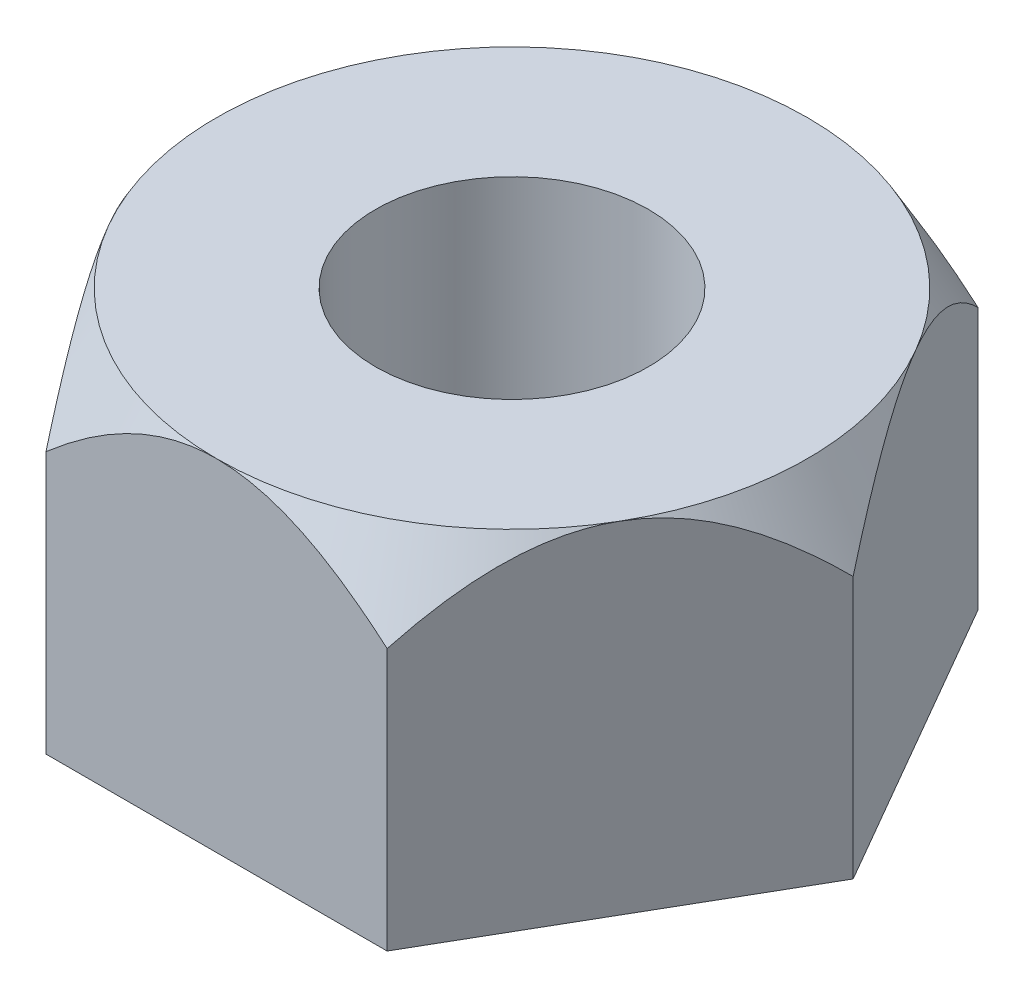
ISO-10303-21;
HEADER;
FILE_DESCRIPTION(('STEP AP214'),'2;1');
FILE_NAME('part.step','',(''),(''),'','','');
FILE_SCHEMA(('AUTOMOTIVE_DESIGN { 1 0 10303 214 1 1 1 1 }'));
ENDSEC;
DATA;
#1=APPLICATION_CONTEXT('core data for automotive mechanical design processes');
#2=APPLICATION_PROTOCOL_DEFINITION('international standard','automotive_design',2000,#1);
#3=PRODUCT_CONTEXT('',#1,'mechanical');
#4=PRODUCT('Part','Part','',(#3));
#5=PRODUCT_RELATED_PRODUCT_CATEGORY('part','',(#4));
#6=PRODUCT_DEFINITION_FORMATION('','',#4);
#7=PRODUCT_DEFINITION_CONTEXT('part definition',#1,'design');
#8=PRODUCT_DEFINITION('design','',#6,#7);
#9=PRODUCT_DEFINITION_SHAPE('','',#8);
#10=(LENGTH_UNIT() NAMED_UNIT(*) SI_UNIT(.MILLI.,.METRE.));
#11=(NAMED_UNIT(*) PLANE_ANGLE_UNIT() SI_UNIT($,.RADIAN.));
#12=(NAMED_UNIT(*) SI_UNIT($,.STERADIAN.) SOLID_ANGLE_UNIT());
#13=UNCERTAINTY_MEASURE_WITH_UNIT(LENGTH_MEASURE(1.E-05),#10,'distance_accuracy_value','');
#14=(GEOMETRIC_REPRESENTATION_CONTEXT(3) GLOBAL_UNCERTAINTY_ASSIGNED_CONTEXT((#13)) GLOBAL_UNIT_ASSIGNED_CONTEXT((#10,
#11,#12)) REPRESENTATION_CONTEXT('',''));
#15=CARTESIAN_POINT('',(0.,0.,0.));
#16=DIRECTION('',(0.,0.,1.));
#17=DIRECTION('',(1.,0.,0.));
#18=AXIS2_PLACEMENT_3D('',#15,#16,#17);
#19=CARTESIAN_POINT('',(0.,5.,0.));
#20=DIRECTION('',(0.,1.,0.));
#21=DIRECTION('',(0.,0.,1.));
#22=AXIS2_PLACEMENT_3D('',#19,#20,#21);
#23=PLANE('',#22);
#24=CARTESIAN_POINT('',(0.,5.,0.));
#25=DIRECTION('',(0.,1.,0.));
#26=DIRECTION('',(0.,0.,1.));
#27=AXIS2_PLACEMENT_3D('',#24,#25,#26);
#28=CIRCLE('',#27,2.);
#29=CARTESIAN_POINT('',(0.,5.,2.));
#30=VERTEX_POINT('',#29);
#31=EDGE_CURVE('E304',#30,#30,#28,.T.);
#32=ORIENTED_EDGE('',*,*,#31,.F.);
#33=EDGE_LOOP('',(#32));
#34=FACE_BOUND('',#33,.T.);
#35=CARTESIAN_POINT('',(0.,5.,0.));
#36=DIRECTION('',(0.,1.,0.));
#37=DIRECTION('',(0.,0.,1.));
#38=AXIS2_PLACEMENT_3D('',#35,#36,#37);
#39=CIRCLE('',#38,4.33012701892221);
#40=CARTESIAN_POINT('',(-3.74999999999998,5.,2.16506350946113));
#41=VERTEX_POINT('',#40);
#42=CARTESIAN_POINT('',(0.,5.,4.33012701892219));
#43=VERTEX_POINT('',#42);
#44=EDGE_CURVE('E154',#41,#43,#39,.T.);
#45=ORIENTED_EDGE('',*,*,#44,.T.);
#46=CARTESIAN_POINT('',(3.75000000000002,5.,2.16506350946108));
#47=VERTEX_POINT('',#46);
#48=EDGE_CURVE('E136',#43,#47,#39,.T.);
#49=ORIENTED_EDGE('',*,*,#48,.T.);
#50=CARTESIAN_POINT('',(3.75,5.,-2.1650635094611));
#51=VERTEX_POINT('',#50);
#52=EDGE_CURVE('E125',#47,#51,#39,.T.);
#53=ORIENTED_EDGE('',*,*,#52,.T.);
#54=CARTESIAN_POINT('',(0.,5.,-4.33012701892219));
#55=VERTEX_POINT('',#54);
#56=EDGE_CURVE('E69',#51,#55,#39,.T.);
#57=ORIENTED_EDGE('',*,*,#56,.T.);
#58=CARTESIAN_POINT('',(-3.75000000000001,5.,-2.16506350946107));
#59=VERTEX_POINT('',#58);
#60=EDGE_CURVE('E77',#55,#59,#39,.T.);
#61=ORIENTED_EDGE('',*,*,#60,.T.);
#62=EDGE_CURVE('E161',#59,#41,#39,.T.);
#63=ORIENTED_EDGE('',*,*,#62,.T.);
#64=EDGE_LOOP('',(#45,#49,#53,#57,#61,#63));
#65=FACE_BOUND('',#64,.T.);
#66=ADVANCED_FACE('F46',(#34,#65),#23,.T.);
#67=CARTESIAN_POINT('',(2.50000000000005,5.,4.33012701892216));
#68=DIRECTION('',(-0.866025403784441,0.,-0.499999999999995));
#69=DIRECTION('',(-0.499999999999995,0.,0.866025403784441));
#70=AXIS2_PLACEMENT_3D('',#67,#68,#69);
#71=PLANE('',#70);
#72=CARTESIAN_POINT('',(2.49988452994621,3.8395459552276,4.33032701892216));
#73=CARTESIAN_POINT('',(2.52603245800554,3.8848339914474,4.28503747901075));
#74=CARTESIAN_POINT('',(2.55244128791382,3.92951803592313,4.23929604384116));
#75=CARTESIAN_POINT('',(2.60583817838497,4.01750976912944,4.14680991657893));
#76=CARTESIAN_POINT('',(2.63282640201025,4.06081706165426,4.10006494205393));
#77=CARTESIAN_POINT('',(2.71500179884512,4.18881585056256,3.95773297960379));
#78=CARTESIAN_POINT('',(2.77113436738581,4.27111911679774,3.86050851893198));
#79=CARTESIAN_POINT('',(2.88776924238884,4.42932238274939,3.65849098949228));
#80=CARTESIAN_POINT('',(2.94834697835078,4.50500200033683,3.5535672729987));
#81=CARTESIAN_POINT('',(3.07278408923163,4.64429961580708,3.33803587460598));
#82=CARTESIAN_POINT('',(3.13663580046347,4.70794428122144,3.22744146660223));
#83=CARTESIAN_POINT('',(3.2378366675211,4.79393750545759,3.05215642308838));
#84=CARTESIAN_POINT('',(3.27400113565673,4.82188687918375,2.98951772684876));
#85=CARTESIAN_POINT('',(3.34727729424076,4.87236847470195,2.86259969719775));
#86=CARTESIAN_POINT('',(3.38438905537677,4.89490029091747,2.79832024135182));
#87=CARTESIAN_POINT('',(3.45911696425962,4.93368543760243,2.66888770642335));
#88=CARTESIAN_POINT('',(3.49672679341896,4.9499870584244,2.60374557145538));
#89=CARTESIAN_POINT('',(3.57251251722487,4.97597375980844,2.47248084733516));
#90=CARTESIAN_POINT('',(3.6106883045947,4.98566007831629,2.40635844399167));
#91=CARTESIAN_POINT('',(3.68767936258864,4.99808653406365,2.27300601981768));
#92=CARTESIAN_POINT('',(3.72649728421043,5.00076182897186,2.20577140732451));
#93=CARTESIAN_POINT('',(3.80408749242931,4.99886400426914,2.07138122451956));
#94=CARTESIAN_POINT('',(3.84285977918336,4.99429090966185,2.00422565393592));
#95=CARTESIAN_POINT('',(3.92011612559996,4.97807202204519,1.87041373673523));
#96=CARTESIAN_POINT('',(3.95859937398989,4.96641085271009,1.80375879528356));
#97=CARTESIAN_POINT('',(4.03492590542164,4.93647663009405,1.67155736487828));
#98=CARTESIAN_POINT('',(4.07276878876885,4.91819959598438,1.60601156821601));
#99=CARTESIAN_POINT('',(4.20657897982356,4.84210445780605,1.37424551873875));
#100=CARTESIAN_POINT('',(4.30021121617737,4.76734971383784,1.21206972814764));
#101=CARTESIAN_POINT('',(4.43543249725157,4.63456913855986,0.977859599062575));
#102=CARTESIAN_POINT('',(4.47974586319208,4.58671256690894,0.901106597799212));
#103=CARTESIAN_POINT('',(4.56673669386177,4.485346588253,0.750434059286693));
#104=CARTESIAN_POINT('',(4.60941442616695,4.4318381112785,0.676514058582299));
#105=CARTESIAN_POINT('',(4.7127668261096,4.29425164004733,0.497502450797453));
#106=CARTESIAN_POINT('',(4.77256183449973,4.20754661318338,0.39393445822673));
#107=CARTESIAN_POINT('',(4.85978832952453,4.07256834333777,0.24285373707762));
#108=CARTESIAN_POINT('',(4.8882984115585,4.02702662505186,0.193472826466821));
#109=CARTESIAN_POINT('',(4.94467395600481,3.93439594598026,0.0958275191814637));
#110=CARTESIAN_POINT('',(4.97253955043799,3.88730730694561,0.0475628938400853));
#111=CARTESIAN_POINT('',(5.00011547005384,3.8395459552276,-0.000199999999999852));
#112=B_SPLINE_CURVE_WITH_KNOTS('',3,(#72,#73,#74,#75,#76,#77,#78,#79,#80,#81,#82,#83,#84,#85,
#86,#87,#88,#89,#90,#91,#92,#93,#94,#95,#96,#97,#98,#99,#100,#101,#102,#103,#104,#105,#106,#107,
#108,#109,#110,#111),.UNSPECIFIED.,.F.,.F.,(4,2,2,2,2,2,2,2,2,2,2,2,2,2,2,2,2,2,2,4),(0.,
0.207530396012228,0.41511998480407,0.832413361514787,1.26048832134564,1.68760332572676,
1.92005107232724,2.15251621533175,2.38314109470961,2.6137228045741,2.84642967265257,
3.0791357380002,3.31234842869416,3.54570167958106,4.14661318376483,4.44867935464675,
4.75069589723913,5.19343142055808,5.41233685043555,5.63119703392207),.UNSPECIFIED.);
#113=CARTESIAN_POINT('',(2.50000000000005,3.83974596215564,4.33012701892216));
#114=VERTEX_POINT('',#113);
#115=EDGE_CURVE('E141',#114,#47,#112,.T.);
#116=ORIENTED_EDGE('',*,*,#115,.F.);
#117=DIRECTION('',(0.,-1.,0.));
#118=VECTOR('',#117,1.);
#119=CARTESIAN_POINT('',(2.50000000000005,5.,4.33012701892216));
#120=LINE('',#119,#118);
#121=CARTESIAN_POINT('',(2.50000000000005,0.,4.33012701892216));
#122=VERTEX_POINT('',#121);
#123=EDGE_CURVE('E267',#114,#122,#120,.T.);
#124=ORIENTED_EDGE('',*,*,#123,.T.);
#125=DIRECTION('',(0.499999999999995,0.,-0.866025403784441));
#126=VECTOR('',#125,1.);
#127=CARTESIAN_POINT('',(2.50000000000005,0.,4.33012701892216));
#128=LINE('',#127,#126);
#129=CARTESIAN_POINT('',(5.,0.,0.));
#130=VERTEX_POINT('',#129);
#131=EDGE_CURVE('E301',#122,#130,#128,.T.);
#132=ORIENTED_EDGE('',*,*,#131,.T.);
#133=DIRECTION('',(0.,-1.,0.));
#134=VECTOR('',#133,1.);
#135=CARTESIAN_POINT('',(5.,5.,0.));
#136=LINE('',#135,#134);
#137=CARTESIAN_POINT('',(5.,3.83974596215564,0.));
#138=VERTEX_POINT('',#137);
#139=EDGE_CURVE('E150',#138,#130,#136,.T.);
#140=ORIENTED_EDGE('',*,*,#139,.F.);
#141=EDGE_CURVE('E129',#47,#138,#112,.T.);
#142=ORIENTED_EDGE('',*,*,#141,.F.);
#143=EDGE_LOOP('',(#116,#124,#132,#140,#142));
#144=FACE_BOUND('',#143,.T.);
#145=ADVANCED_FACE('F48',(#144),#71,.F.);
#146=CARTESIAN_POINT('',(5.,5.,0.));
#147=DIRECTION('',(-0.866025403784438,0.,0.500000000000001));
#148=DIRECTION('',(0.500000000000001,0.,0.866025403784438));
#149=AXIS2_PLACEMENT_3D('',#146,#147,#148);
#150=PLANE('',#149);
#151=CARTESIAN_POINT('',(5.00011547005384,3.8395459552276,0.000200000000000032));
#152=CARTESIAN_POINT('',(4.97396754199451,3.88483399144739,-0.0450895399114115));
#153=CARTESIAN_POINT('',(4.94755871208623,3.92951803592313,-0.0908309750810041));
#154=CARTESIAN_POINT('',(4.89416182161507,4.01750976912944,-0.183317102343228));
#155=CARTESIAN_POINT('',(4.8671735979898,4.06081706165426,-0.230062076868234));
#156=CARTESIAN_POINT('',(4.78499820115492,4.18881585056256,-0.372394039318373));
#157=CARTESIAN_POINT('',(4.72886563261424,4.27111911679774,-0.469618499990178));
#158=CARTESIAN_POINT('',(4.61223075761121,4.42932238274939,-0.671636029429878));
#159=CARTESIAN_POINT('',(4.55165302164927,4.50500200033683,-0.776559745923452));
#160=CARTESIAN_POINT('',(4.42721591076841,4.64429961580709,-0.992091144316173));
#161=CARTESIAN_POINT('',(4.36336419953658,4.70794428122145,-1.10268555231992));
#162=CARTESIAN_POINT('',(4.26216333247894,4.79393750545761,-1.27797059583377));
#163=CARTESIAN_POINT('',(4.22599886434331,4.82188687918376,-1.34060929207339));
#164=CARTESIAN_POINT('',(4.15272270575928,4.87236847470197,-1.4675273217244));
#165=CARTESIAN_POINT('',(4.11561094462327,4.89490029091749,-1.53180677757033));
#166=CARTESIAN_POINT('',(4.04088303574042,4.93368543760245,-1.6612393124988));
#167=CARTESIAN_POINT('',(4.00327320658108,4.94998705842442,-1.72638144746677));
#168=CARTESIAN_POINT('',(3.92748748277517,4.97597375980847,-1.85764617158699));
#169=CARTESIAN_POINT('',(3.88931169540534,4.98566007831631,-1.92376857493048));
#170=CARTESIAN_POINT('',(3.8123206374114,4.99808653406368,-2.05712099910447));
#171=CARTESIAN_POINT('',(3.77350271578961,5.00076182897189,-2.12435561159764));
#172=CARTESIAN_POINT('',(3.69591250757073,4.99886400426917,-2.25874579440259));
#173=CARTESIAN_POINT('',(3.65714022081668,4.99429090966188,-2.32590136498623));
#174=CARTESIAN_POINT('',(3.57988387440008,4.97807202204523,-2.45971328218692));
#175=CARTESIAN_POINT('',(3.54140062601014,4.96641085271012,-2.52636822363859));
#176=CARTESIAN_POINT('',(3.4650740945784,4.93647663009408,-2.65856965404387));
#177=CARTESIAN_POINT('',(3.42723121123119,4.91819959598441,-2.72411545070614));
#178=CARTESIAN_POINT('',(3.29342102017647,4.84210445780609,-2.9558815001834));
#179=CARTESIAN_POINT('',(3.19978878382266,4.76734971383788,-3.1180572907745));
#180=CARTESIAN_POINT('',(3.06456750274846,4.63456913855991,-3.35226741985956));
#181=CARTESIAN_POINT('',(3.02025413680795,4.58671256690899,-3.42902042112292));
#182=CARTESIAN_POINT('',(2.93326330613827,4.48534658825306,-3.57969295963544));
#183=CARTESIAN_POINT('',(2.89058557383309,4.43183811127856,-3.65361296033983));
#184=CARTESIAN_POINT('',(2.78723317389043,4.29425164004739,-3.83262456812469));
#185=CARTESIAN_POINT('',(2.72743816550029,4.20754661318343,-3.93619256069542));
#186=CARTESIAN_POINT('',(2.64021167047548,4.0725683433378,-4.08727328184455));
#187=CARTESIAN_POINT('',(2.6117015884415,4.02702662505189,-4.13665419245536));
#188=CARTESIAN_POINT('',(2.55532604399519,3.93439594598027,-4.23429949974073));
#189=CARTESIAN_POINT('',(2.527460449562,3.88730730694561,-4.28256412508211));
#190=CARTESIAN_POINT('',(2.49988452994615,3.8395459552276,-4.3303270189222));
#191=B_SPLINE_CURVE_WITH_KNOTS('',3,(#151,#152,#153,#154,#155,#156,#157,#158,#159,#160,#161,
#162,#163,#164,#165,#166,#167,#168,#169,#170,#171,#172,#173,#174,#175,#176,#177,#178,#179,#180,
#181,#182,#183,#184,#185,#186,#187,#188,#189,#190),.UNSPECIFIED.,.F.,.F.,(4,2,2,2,2,2,2,2,2,2,2,
2,2,2,2,2,2,2,2,4),(0.,0.207530396012229,0.41511998480407,0.832413361514788,1.26048832134564,
1.68760332572676,1.92005107232724,2.15251621533175,2.38314109470961,2.6137228045741,
2.84642967265257,3.0791357380002,3.31234842869417,3.54570167958106,4.14661318376482,
4.44867935464674,4.75069589723911,5.19343142055811,5.41233685043561,5.63119703392216),.UNSPECIFIED.);
#192=EDGE_CURVE('E131',#138,#51,#191,.T.);
#193=ORIENTED_EDGE('',*,*,#192,.F.);
#194=ORIENTED_EDGE('',*,*,#139,.T.);
#195=DIRECTION('',(-0.500000000000001,0.,-0.866025403784438));
#196=VECTOR('',#195,1.);
#197=CARTESIAN_POINT('',(5.,0.,0.));
#198=LINE('',#197,#196);
#199=CARTESIAN_POINT('',(2.49999999999999,0.,-4.3301270189222));
#200=VERTEX_POINT('',#199);
#201=EDGE_CURVE('E298',#130,#200,#198,.T.);
#202=ORIENTED_EDGE('',*,*,#201,.T.);
#203=DIRECTION('',(0.,-1.,0.));
#204=VECTOR('',#203,1.);
#205=CARTESIAN_POINT('',(2.49999999999999,5.,-4.3301270189222));
#206=LINE('',#205,#204);
#207=CARTESIAN_POINT('',(2.49999999999999,3.83974596215564,-4.3301270189222));
#208=VERTEX_POINT('',#207);
#209=EDGE_CURVE('E270',#208,#200,#206,.T.);
#210=ORIENTED_EDGE('',*,*,#209,.F.);
#211=EDGE_CURVE('E221',#51,#208,#191,.T.);
#212=ORIENTED_EDGE('',*,*,#211,.F.);
#213=EDGE_LOOP('',(#193,#194,#202,#210,#212));
#214=FACE_BOUND('',#213,.T.);
#215=ADVANCED_FACE('F228',(#214),#150,.F.);
#216=CARTESIAN_POINT('',(2.49999999999999,5.,-4.3301270189222));
#217=DIRECTION('',(0.,0.,1.));
#218=DIRECTION('',(1.,0.,0.));
#219=AXIS2_PLACEMENT_3D('',#216,#217,#218);
#220=PLANE('',#219);
#221=CARTESIAN_POINT('',(9.57126781186547,-5.69553523750689,-4.33012701892222));
#222=CARTESIAN_POINT('',(9.43890087127089,-5.48665473587678,-4.33012701892222));
#223=CARTESIAN_POINT('',(9.30620478599514,-5.2779829327792,-4.33012701892222));
#224=CARTESIAN_POINT('',(9.04006071179976,-4.86111741348949,-4.33012701892222));
#225=CARTESIAN_POINT('',(8.90661271766159,-4.65292370062966,-4.33012701892222));
#226=CARTESIAN_POINT('',(8.50495406084453,-4.02907874106976,-4.33012701892222));
#227=CARTESIAN_POINT('',(8.23547725724544,-3.61424041440431,-4.33012701892222));
#228=CARTESIAN_POINT('',(7.69461775551903,-2.79123326932731,-4.33012701892222));
#229=CARTESIAN_POINT('',(7.42327511086726,-2.38303816342348,-4.33012701892222));
#230=CARTESIAN_POINT('',(6.87486460932084,-1.57055226051518,-4.33012701892221));
#231=CARTESIAN_POINT('',(6.59779731971504,-1.16626108241839,-4.33012701892221));
#232=CARTESIAN_POINT('',(6.1481309630827,-0.523880785612531,-4.33012701892221));
#233=CARTESIAN_POINT('',(5.97808298026972,-0.28400763816145,-4.33012701892221));
#234=CARTESIAN_POINT('',(5.63439122578751,0.193199131125467,-4.33012701892221));
#235=CARTESIAN_POINT('',(5.46074701965729,0.43053244080727,-4.33012701892221));
#236=CARTESIAN_POINT('',(5.1076631450043,0.903587533099109,-4.33012701892221));
#237=CARTESIAN_POINT('',(4.92819022832959,1.13928459895681,-4.33012701892221));
#238=CARTESIAN_POINT('',(4.56342256421092,1.60600488445189,-4.33012701892221));
#239=CARTESIAN_POINT('',(4.37812998026908,1.83702978969913,-4.33012701892221));
#240=CARTESIAN_POINT('',(3.99765191927236,2.29526422504256,-4.3301270189222));
#241=CARTESIAN_POINT('',(3.8023787119456,2.5224017718924,-4.3301270189222));
#242=CARTESIAN_POINT('',(3.50117761389595,2.85598642974674,-4.3301270189222));
#243=CARTESIAN_POINT('',(3.39930089236946,2.96608928470792,-4.3301270189222));
#244=CARTESIAN_POINT('',(3.19232661211699,3.18321684270268,-4.3301270189222));
#245=CARTESIAN_POINT('',(3.08722939626241,3.29024187108279,-4.3301270189222));
#246=CARTESIAN_POINT('',(2.87407140281385,3.49955988353941,-4.3301270189222));
#247=CARTESIAN_POINT('',(2.76604148741504,3.60188415078054,-4.3301270189222));
#248=CARTESIAN_POINT('',(2.5454576105108,3.80163699750911,-4.3301270189222));
#249=CARTESIAN_POINT('',(2.43290234750933,3.89906415018765,-4.3301270189222));
#250=CARTESIAN_POINT('',(2.20280300225859,4.08713874028658,-4.3301270189222));
#251=CARTESIAN_POINT('',(2.08527536988563,4.17780615301432,-4.3301270189222));
#252=CARTESIAN_POINT('',(1.84403931000857,4.35044404582545,-4.3301270189222));
#253=CARTESIAN_POINT('',(1.72033604147699,4.43242161211331,-4.3301270189222));
#254=CARTESIAN_POINT('',(1.50617656410508,4.56049206839694,-4.3301270189222));
#255=CARTESIAN_POINT('',(1.41760464311508,4.60972512437118,-4.33012701892219));
#256=CARTESIAN_POINT('',(1.23695898898306,4.70142137369473,-4.33012701892219));
#257=CARTESIAN_POINT('',(1.1448845258045,4.74388314602013,-4.33012701892219));
#258=CARTESIAN_POINT('',(0.957777865204534,4.82032835322276,-4.33012701892219));
#259=CARTESIAN_POINT('',(0.86276265997709,4.85435291389048,-4.33012701892219));
#260=CARTESIAN_POINT('',(0.669732050920103,4.91260339509047,-4.33012701892219));
#261=CARTESIAN_POINT('',(0.571717190299415,4.93683107858071,-4.33012701892219));
#262=CARTESIAN_POINT('',(0.400486413432419,4.96901724967442,-4.33012701892219));
#263=CARTESIAN_POINT('',(0.327760577222123,4.97960673833851,-4.33012701892219));
#264=CARTESIAN_POINT('',(0.181696125782675,4.99446106499573,-4.33012701892219));
#265=CARTESIAN_POINT('',(0.108357878604106,4.99872946044843,-4.33012701892219));
#266=CARTESIAN_POINT('',(-0.0384932907513533,5.00078244142962,-4.33012701892219));
#267=CARTESIAN_POINT('',(-0.112006316409952,4.99855985004568,-4.33012701892219));
#268=CARTESIAN_POINT('',(-0.258546349959959,4.98771550116077,-4.33012701892219));
#269=CARTESIAN_POINT('',(-0.331573325434166,4.97909332106885,-4.33012701892219));
#270=CARTESIAN_POINT('',(-0.54831941355253,4.94418200694952,-4.33012701892219));
#271=CARTESIAN_POINT('',(-0.690643163572318,4.90885480576798,-4.33012701892219));
#272=CARTESIAN_POINT('',(-0.968589137219944,4.81832112208374,-4.33012701892219));
#273=CARTESIAN_POINT('',(-1.10420845541587,4.76310610541058,-4.33012701892219));
#274=CARTESIAN_POINT('',(-1.36288781923114,4.64011166086213,-4.33012701892219));
#275=CARTESIAN_POINT('',(-1.48623279970086,4.57291882345755,-4.33012701892218));
#276=CARTESIAN_POINT('',(-1.72667851642542,4.42806879446843,-4.33012701892218));
#277=CARTESIAN_POINT('',(-1.84377309299484,4.35040153686074,-4.33012701892218));
#278=CARTESIAN_POINT('',(-2.07288662860849,4.18689305067501,-4.33012701892218));
#279=CARTESIAN_POINT('',(-2.18487877878435,4.10101467873679,-4.33012701892218));
#280=CARTESIAN_POINT('',(-2.40394848786413,3.92335552356215,-4.33012701892218));
#281=CARTESIAN_POINT('',(-2.51102837622748,3.8315775886116,-4.33012701892218));
#282=CARTESIAN_POINT('',(-2.71982224858491,3.64457034389633,-4.33012701892218));
#283=CARTESIAN_POINT('',(-2.82158488136488,3.54939501843348,-4.33012701892218));
#284=CARTESIAN_POINT('',(-3.02170511849201,3.35551962471783,-4.33012701892218));
#285=CARTESIAN_POINT('',(-3.120062236352,3.25681905693237,-4.33012701892218));
#286=CARTESIAN_POINT('',(-3.41092450440668,2.95640936450181,-4.33012701892218));
#287=CARTESIAN_POINT('',(-3.59909545817485,2.75050740359015,-4.33012701892218));
#288=CARTESIAN_POINT('',(-3.9673492816849,2.33082649637526,-4.33012701892218));
#289=CARTESIAN_POINT('',(-4.14741181195314,2.1170299507676,-4.33012701892218));
#290=CARTESIAN_POINT('',(-4.50109513460675,1.68414892475071,-4.33012701892217));
#291=CARTESIAN_POINT('',(-4.67471511410724,1.46506378277332,-4.33012701892217));
#292=CARTESIAN_POINT('',(-5.01774866442464,1.02201632541429,-4.33012701892217));
#293=CARTESIAN_POINT('',(-5.18713900552021,0.798036109472277,-4.33012701892217));
#294=CARTESIAN_POINT('',(-5.52195324347701,0.3471117554489,-4.33012701892217));
#295=CARTESIAN_POINT('',(-5.68737683529603,0.120167391484863,-4.33012701892217));
#296=CARTESIAN_POINT('',(-6.0147862096785,-0.335675708306007,-4.33012701892217));
#297=CARTESIAN_POINT('',(-6.17677670122838,-0.564571069362867,-4.33012701892217));
#298=CARTESIAN_POINT('',(-6.49815541884869,-1.02418055126393,-4.33012701892217));
#299=CARTESIAN_POINT('',(-6.65754362714599,-1.25489468451406,-4.33012701892217));
#300=CARTESIAN_POINT('',(-7.05390639248597,-1.83435611989218,-4.33012701892217));
#301=CARTESIAN_POINT('',(-7.28952749416473,-2.18402866136909,-4.33012701892216));
#302=CARTESIAN_POINT('',(-7.75713368374627,-2.88599025979726,-4.33012701892216));
#303=CARTESIAN_POINT('',(-7.98911729113954,-3.2382803003178,-4.33012701892216));
#304=CARTESIAN_POINT('',(-8.44746431513134,-3.94065135779496,-4.33012701892216));
#305=CARTESIAN_POINT('',(-8.67386172407757,-4.2907102248995,-4.33012701892216));
#306=CARTESIAN_POINT('',(-9.12422719132734,-4.99217043913333,-4.33012701892216));
#307=CARTESIAN_POINT('',(-9.34819627529507,-5.34357112737039,-4.33012701892216));
#308=CARTESIAN_POINT('',(-9.5712678118655,-5.69553523750689,-4.33012701892216));
#309=B_SPLINE_CURVE_WITH_KNOTS('',3,(#221,#222,#223,#224,#225,#226,#227,#228,#229,#230,#231,
#232,#233,#234,#235,#236,#237,#238,#239,#240,#241,#242,#243,#244,#245,#246,#247,#248,#249,#250,
#251,#252,#253,#254,#255,#256,#257,#258,#259,#260,#261,#262,#263,#264,#265,#266,#267,#268,#269,
#270,#271,#272,#273,#274,#275,#276,#277,#278,#279,#280,#281,#282,#283,#284,#285,#286,#287,#288,
#289,#290,#291,#292,#293,#294,#295,#296,#297,#298,#299,#300,#301,#302,#303,#304,#305,#306,#307,
#308),.UNSPECIFIED.,.F.,.F.,(4,2,2,2,2,2,2,2,2,2,2,2,2,2,2,2,2,2,2,2,2,2,2,2,2,2,2,2,2,2,2,2,2,
2,2,2,2,2,2,2,2,2,2,4),(0.,0.741867612418168,1.48374038004767,2.96775830929576,4.43818591619075,
5.90846850203879,6.79054262724961,7.67272394504386,8.56139805903779,9.44974562404853,
10.348069466652,10.7980339012591,11.2479505955118,11.6942266372661,12.1406319598299,
12.5856610523897,13.0303244045293,13.3341004843961,13.6379402311575,13.9402684876837,
14.2425423156972,14.4627690365022,14.682871768345,14.9032179540589,15.1235786914248,
15.5615190931954,15.999647646321,16.4203628649509,16.8414853151338,17.2646120256441,
17.6875359646506,18.1054333938601,18.5233902766094,19.3598132735699,20.1982291877272,
21.0367505312644,21.8791588681752,22.7216317797037,23.5628625813227,24.4040991259945,
25.6690130736292,26.9344291510895,28.1850881044726,29.435196442397),.UNSPECIFIED.);
#310=EDGE_CURVE('E227',#208,#55,#309,.T.);
#311=ORIENTED_EDGE('',*,*,#310,.F.);
#312=ORIENTED_EDGE('',*,*,#209,.T.);
#313=DIRECTION('',(-1.,0.,0.));
#314=VECTOR('',#313,1.);
#315=CARTESIAN_POINT('',(2.49999999999999,0.,-4.3301270189222));
#316=LINE('',#315,#314);
#317=CARTESIAN_POINT('',(-2.50000000000002,0.,-4.33012701892218));
#318=VERTEX_POINT('',#317);
#319=EDGE_CURVE('E294',#200,#318,#316,.T.);
#320=ORIENTED_EDGE('',*,*,#319,.T.);
#321=DIRECTION('',(0.,-1.,0.));
#322=VECTOR('',#321,1.);
#323=CARTESIAN_POINT('',(-2.50000000000002,5.,-4.33012701892218));
#324=LINE('',#323,#322);
#325=CARTESIAN_POINT('',(-2.50000000000002,3.83974596215564,-4.33012701892218));
#326=VERTEX_POINT('',#325);
#327=EDGE_CURVE('E274',#326,#318,#324,.T.);
#328=ORIENTED_EDGE('',*,*,#327,.F.);
#329=EDGE_CURVE('E176',#55,#326,#309,.T.);
#330=ORIENTED_EDGE('',*,*,#329,.F.);
#331=EDGE_LOOP('',(#311,#312,#320,#328,#330));
#332=FACE_BOUND('',#331,.T.);
#333=ADVANCED_FACE('F231',(#332),#220,.F.);
#334=CARTESIAN_POINT('',(-2.50000000000002,5.,-4.33012701892218));
#335=DIRECTION('',(0.866025403784442,0.,0.499999999999995));
#336=DIRECTION('',(0.499999999999995,0.,-0.866025403784442));
#337=AXIS2_PLACEMENT_3D('',#334,#335,#336);
#338=PLANE('',#337);
#339=CARTESIAN_POINT('',(-2.49988452994618,3.8395459552276,-4.33032701892218));
#340=CARTESIAN_POINT('',(-2.52603245800551,3.8848339914474,-4.28503747901077));
#341=CARTESIAN_POINT('',(-2.55244128791379,3.92951803592313,-4.23929604384118));
#342=CARTESIAN_POINT('',(-2.60583817838494,4.01750976912944,-4.14680991657895));
#343=CARTESIAN_POINT('',(-2.63282640201022,4.06081706165427,-4.10006494205395));
#344=CARTESIAN_POINT('',(-2.71500179884509,4.18881585056256,-3.95773297960381));
#345=CARTESIAN_POINT('',(-2.77113436738577,4.27111911679774,-3.860508518932));
#346=CARTESIAN_POINT('',(-2.88776924238881,4.42932238274939,-3.6584909894923));
#347=CARTESIAN_POINT('',(-2.94834697835075,4.50500200033684,-3.55356727299873));
#348=CARTESIAN_POINT('',(-3.0727840892316,4.64429961580709,-3.338035874606));
#349=CARTESIAN_POINT('',(-3.13663580046343,4.70794428122145,-3.22744146660225));
#350=CARTESIAN_POINT('',(-3.23783666752107,4.79393750545761,-3.0521564230884));
#351=CARTESIAN_POINT('',(-3.2740011356567,4.82188687918376,-2.98951772684878));
#352=CARTESIAN_POINT('',(-3.34727729424072,4.87236847470197,-2.86259969719778));
#353=CARTESIAN_POINT('',(-3.38438905537674,4.89490029091748,-2.79832024135184));
#354=CARTESIAN_POINT('',(-3.45911696425958,4.93368543760245,-2.66888770642337));
#355=CARTESIAN_POINT('',(-3.49672679341892,4.94998705842442,-2.60374557145541));
#356=CARTESIAN_POINT('',(-3.57251251722483,4.97597375980847,-2.47248084733519));
#357=CARTESIAN_POINT('',(-3.61068830459467,4.98566007831631,-2.40635844399169));
#358=CARTESIAN_POINT('',(-3.6876793625886,4.99808653406368,-2.27300601981771));
#359=CARTESIAN_POINT('',(-3.72649728421039,5.00076182897189,-2.20577140732454));
#360=CARTESIAN_POINT('',(-3.80408749242928,4.99886400426918,-2.07138122451959));
#361=CARTESIAN_POINT('',(-3.84285977918332,4.99429090966188,-2.00422565393595));
#362=CARTESIAN_POINT('',(-3.92011612559992,4.97807202204523,-1.87041373673525));
#363=CARTESIAN_POINT('',(-3.95859937398986,4.96641085271013,-1.80375879528358));
#364=CARTESIAN_POINT('',(-4.0349259054216,4.93647663009408,-1.6715573648783));
#365=CARTESIAN_POINT('',(-4.07276878876881,4.91819959598442,-1.60601156821603));
#366=CARTESIAN_POINT('',(-4.20657897982352,4.8421044578061,-1.37424551873877));
#367=CARTESIAN_POINT('',(-4.30021121617733,4.76734971383789,-1.21206972814767));
#368=CARTESIAN_POINT('',(-4.43543249725153,4.63456913855991,-0.977859599062608));
#369=CARTESIAN_POINT('',(-4.47974586319204,4.58671256690899,-0.901106597799246));
#370=CARTESIAN_POINT('',(-4.56673669386173,4.48534658825306,-0.750434059286729));
#371=CARTESIAN_POINT('',(-4.60941442616691,4.43183811127856,-0.676514058582336));
#372=CARTESIAN_POINT('',(-4.71276682610956,4.29425164004739,-0.497502450797477));
#373=CARTESIAN_POINT('',(-4.7725618344997,4.20754661318342,-0.393934458226741));
#374=CARTESIAN_POINT('',(-4.85978832952451,4.07256834333779,-0.242853737077613));
#375=CARTESIAN_POINT('',(-4.88829841155849,4.02702662505189,-0.193472826466808));
#376=CARTESIAN_POINT('',(-4.9446739560048,3.93439594598027,-0.0958275191814388));
#377=CARTESIAN_POINT('',(-4.97253955043799,3.88730730694561,-0.0475628938400553));
#378=CARTESIAN_POINT('',(-5.00011547005384,3.8395459552276,0.000200000000034501));
#379=B_SPLINE_CURVE_WITH_KNOTS('',3,(#339,#340,#341,#342,#343,#344,#345,#346,#347,#348,#349,
#350,#351,#352,#353,#354,#355,#356,#357,#358,#359,#360,#361,#362,#363,#364,#365,#366,#367,#368,
#369,#370,#371,#372,#373,#374,#375,#376,#377,#378),.UNSPECIFIED.,.F.,.F.,(4,2,2,2,2,2,2,2,2,2,2,
2,2,2,2,2,2,2,2,4),(0.,0.207530396012229,0.41511998480407,0.832413361514787,1.26048832134564,
1.68760332572676,1.92005107232724,2.15251621533175,2.38314109470961,2.6137228045741,
2.84642967265257,3.0791357380002,3.31234842869416,3.54570167958106,4.14661318376482,
4.44867935464674,4.75069589723911,5.19343142055811,5.41233685043561,5.63119703392216),.UNSPECIFIED.);
#380=EDGE_CURVE('E173',#326,#59,#379,.T.);
#381=ORIENTED_EDGE('',*,*,#380,.F.);
#382=ORIENTED_EDGE('',*,*,#327,.T.);
#383=DIRECTION('',(-0.499999999999995,0.,0.866025403784441));
#384=VECTOR('',#383,1.);
#385=CARTESIAN_POINT('',(-2.50000000000002,0.,-4.33012701892218));
#386=LINE('',#385,#384);
#387=CARTESIAN_POINT('',(-5.,0.,0.));
#388=VERTEX_POINT('',#387);
#389=EDGE_CURVE('E291',#318,#388,#386,.T.);
#390=ORIENTED_EDGE('',*,*,#389,.T.);
#391=DIRECTION('',(0.,-1.,0.));
#392=VECTOR('',#391,1.);
#393=CARTESIAN_POINT('',(-5.,5.,0.));
#394=LINE('',#393,#392);
#395=CARTESIAN_POINT('',(-5.,3.83974596215564,0.));
#396=VERTEX_POINT('',#395);
#397=EDGE_CURVE('E184',#396,#388,#394,.T.);
#398=ORIENTED_EDGE('',*,*,#397,.F.);
#399=EDGE_CURVE('E169',#59,#396,#379,.T.);
#400=ORIENTED_EDGE('',*,*,#399,.F.);
#401=EDGE_LOOP('',(#381,#382,#390,#398,#400));
#402=FACE_BOUND('',#401,.T.);
#403=ADVANCED_FACE('F182',(#402),#338,.F.);
#404=CARTESIAN_POINT('',(-5.,5.,0.));
#405=DIRECTION('',(0.866025403784435,0.,-0.500000000000007));
#406=DIRECTION('',(-0.500000000000007,0.,-0.866025403784435));
#407=AXIS2_PLACEMENT_3D('',#404,#405,#406);
#408=PLANE('',#407);
#409=CARTESIAN_POINT('',(-5.00011547005384,3.8395459552276,-0.000199999999965208));
#410=CARTESIAN_POINT('',(-4.97396754199451,3.8848339914474,0.045089539911446));
#411=CARTESIAN_POINT('',(-4.94755871208622,3.92951803592313,0.0908309750810385));
#412=CARTESIAN_POINT('',(-4.89416182161507,4.01750976912944,0.183317102343263));
#413=CARTESIAN_POINT('',(-4.8671735979898,4.06081706165427,0.230062076868268));
#414=CARTESIAN_POINT('',(-4.78499820115492,4.18881585056256,0.372394039318407));
#415=CARTESIAN_POINT('',(-4.72886563261424,4.27111911679774,0.469618499990212));
#416=CARTESIAN_POINT('',(-4.6122307576112,4.42932238274939,0.67163602942991));
#417=CARTESIAN_POINT('',(-4.55165302164926,4.50500200033684,0.776559745923483));
#418=CARTESIAN_POINT('',(-4.4272159107684,4.64429961580709,0.992091144316204));
#419=CARTESIAN_POINT('',(-4.36336419953657,4.70794428122145,1.10268555231996));
#420=CARTESIAN_POINT('',(-4.26216333247893,4.79393750545761,1.2779705958338));
#421=CARTESIAN_POINT('',(-4.2259988643433,4.82188687918376,1.34060929207342));
#422=CARTESIAN_POINT('',(-4.15272270575927,4.87236847470197,1.46752732172443));
#423=CARTESIAN_POINT('',(-4.11561094462326,4.89490029091749,1.53180677757036));
#424=CARTESIAN_POINT('',(-4.04088303574041,4.93368543760245,1.66123931249883));
#425=CARTESIAN_POINT('',(-4.00327320658107,4.94998705842443,1.7263814474668));
#426=CARTESIAN_POINT('',(-3.92748748277516,4.97597375980847,1.85764617158701));
#427=CARTESIAN_POINT('',(-3.88931169540533,4.98566007831632,1.92376857493051));
#428=CARTESIAN_POINT('',(-3.81232063741139,4.99808653406368,2.05712099910449));
#429=CARTESIAN_POINT('',(-3.77350271578959,5.00076182897189,2.12435561159766));
#430=CARTESIAN_POINT('',(-3.69591250757071,4.99886400426918,2.25874579440261));
#431=CARTESIAN_POINT('',(-3.65714022081666,4.99429090966188,2.32590136498625));
#432=CARTESIAN_POINT('',(-3.57988387440006,4.97807202204523,2.45971328218695));
#433=CARTESIAN_POINT('',(-3.54140062601012,4.96641085271013,2.52636822363861));
#434=CARTESIAN_POINT('',(-3.46507409457838,4.93647663009408,2.6585696540439));
#435=CARTESIAN_POINT('',(-3.42723121123117,4.91819959598442,2.72411545070616));
#436=CARTESIAN_POINT('',(-3.29342102017645,4.84210445780609,2.95588150018342));
#437=CARTESIAN_POINT('',(-3.19978878382264,4.76734971383789,3.11805729077452));
#438=CARTESIAN_POINT('',(-3.06456750274844,4.63456913855991,3.35226741985958));
#439=CARTESIAN_POINT('',(-3.02025413680793,4.58671256690899,3.42902042112294));
#440=CARTESIAN_POINT('',(-2.93326330613824,4.48534658825306,3.57969295963546));
#441=CARTESIAN_POINT('',(-2.89058557383306,4.43183811127856,3.65361296033985));
#442=CARTESIAN_POINT('',(-2.7872331738904,4.29425164004739,3.83262456812471));
#443=CARTESIAN_POINT('',(-2.72743816550026,4.20754661318342,3.93619256069544));
#444=CARTESIAN_POINT('',(-2.64021167047545,4.0725683433378,4.08727328184457));
#445=CARTESIAN_POINT('',(-2.61170158844147,4.02702662505189,4.13665419245538));
#446=CARTESIAN_POINT('',(-2.55532604399516,3.93439594598027,4.23429949974074));
#447=CARTESIAN_POINT('',(-2.52746044956197,3.88730730694561,4.28256412508213));
#448=CARTESIAN_POINT('',(-2.49988452994612,3.8395459552276,4.33032701892222));
#449=B_SPLINE_CURVE_WITH_KNOTS('',3,(#409,#410,#411,#412,#413,#414,#415,#416,#417,#418,#419,
#420,#421,#422,#423,#424,#425,#426,#427,#428,#429,#430,#431,#432,#433,#434,#435,#436,#437,#438,
#439,#440,#441,#442,#443,#444,#445,#446,#447,#448),.UNSPECIFIED.,.F.,.F.,(4,2,2,2,2,2,2,2,2,2,2,
2,2,2,2,2,2,2,2,4),(0.,0.207530396012229,0.41511998480407,0.832413361514788,1.26048832134564,
1.68760332572676,1.92005107232724,2.15251621533175,2.38314109470961,2.6137228045741,
2.84642967265257,3.0791357380002,3.31234842869417,3.54570167958106,4.14661318376482,
4.44867935464674,4.75069589723911,5.19343142055811,5.41233685043561,5.63119703392216),.UNSPECIFIED.);
#450=EDGE_CURVE('E158',#396,#41,#449,.T.);
#451=ORIENTED_EDGE('',*,*,#450,.F.);
#452=ORIENTED_EDGE('',*,*,#397,.T.);
#453=DIRECTION('',(0.500000000000007,0.,0.866025403784434));
#454=VECTOR('',#453,1.);
#455=CARTESIAN_POINT('',(-5.,0.,0.));
#456=LINE('',#455,#454);
#457=CARTESIAN_POINT('',(-2.49999999999996,0.,4.33012701892222));
#458=VERTEX_POINT('',#457);
#459=EDGE_CURVE('E288',#388,#458,#456,.T.);
#460=ORIENTED_EDGE('',*,*,#459,.T.);
#461=DIRECTION('',(0.,-1.,0.));
#462=VECTOR('',#461,1.);
#463=CARTESIAN_POINT('',(-2.49999999999996,5.,4.33012701892222));
#464=LINE('',#463,#462);
#465=CARTESIAN_POINT('',(-2.49999999999996,3.83974596215564,4.33012701892222));
#466=VERTEX_POINT('',#465);
#467=EDGE_CURVE('E263',#466,#458,#464,.T.);
#468=ORIENTED_EDGE('',*,*,#467,.F.);
#469=EDGE_CURVE('E156',#41,#466,#449,.T.);
#470=ORIENTED_EDGE('',*,*,#469,.F.);
#471=EDGE_LOOP('',(#451,#452,#460,#468,#470));
#472=FACE_BOUND('',#471,.T.);
#473=ADVANCED_FACE('F239',(#472),#408,.F.);
#474=CARTESIAN_POINT('',(-2.49999999999996,5.,4.33012701892222));
#475=DIRECTION('',(0.,0.,-1.));
#476=DIRECTION('',(-1.,0.,0.));
#477=AXIS2_PLACEMENT_3D('',#474,#475,#476);
#478=PLANE('',#477);
#479=CARTESIAN_POINT('',(-9.57126781186544,-5.6955352375069,4.33012701892229));
#480=CARTESIAN_POINT('',(-9.43890087127087,-5.48665473587678,4.33012701892229));
#481=CARTESIAN_POINT('',(-9.30620478599511,-5.2779829327792,4.33012701892229));
#482=CARTESIAN_POINT('',(-9.04006071179973,-4.8611174134895,4.33012701892229));
#483=CARTESIAN_POINT('',(-8.90661271766156,-4.65292370062966,4.33012701892228));
#484=CARTESIAN_POINT('',(-8.5049540608445,-4.02907874106976,4.33012701892228));
#485=CARTESIAN_POINT('',(-8.23547725724541,-3.61424041440431,4.33012701892228));
#486=CARTESIAN_POINT('',(-7.694617755519,-2.79123326932731,4.33012701892227));
#487=CARTESIAN_POINT('',(-7.42327511086723,-2.38303816342348,4.33012701892227));
#488=CARTESIAN_POINT('',(-6.87486460932081,-1.57055226051518,4.33012701892226));
#489=CARTESIAN_POINT('',(-6.59779731971501,-1.16626108241839,4.33012701892226));
#490=CARTESIAN_POINT('',(-6.14813096308266,-0.523880785612524,4.33012701892225));
#491=CARTESIAN_POINT('',(-5.97808298026968,-0.284007638161442,4.33012701892225));
#492=CARTESIAN_POINT('',(-5.63439122578747,0.193199131125478,4.33012701892225));
#493=CARTESIAN_POINT('',(-5.46074701965725,0.430532440807284,4.33012701892225));
#494=CARTESIAN_POINT('',(-5.10766314500426,0.903587533099126,4.33012701892224));
#495=CARTESIAN_POINT('',(-4.92819022832954,1.13928459895683,4.33012701892224));
#496=CARTESIAN_POINT('',(-4.56342256421087,1.60600488445192,4.33012701892224));
#497=CARTESIAN_POINT('',(-4.37812998026903,1.83702978969915,4.33012701892224));
#498=CARTESIAN_POINT('',(-3.99765191927231,2.29526422504259,4.33012701892223));
#499=CARTESIAN_POINT('',(-3.80237871194554,2.52240177189243,4.33012701892223));
#500=CARTESIAN_POINT('',(-3.50117761389589,2.85598642974677,4.33012701892223));
#501=CARTESIAN_POINT('',(-3.3993008923694,2.96608928470796,4.33012701892223));
#502=CARTESIAN_POINT('',(-3.19232661211693,3.18321684270271,4.33012701892222));
#503=CARTESIAN_POINT('',(-3.08722939626235,3.29024187108283,4.33012701892222));
#504=CARTESIAN_POINT('',(-2.87407140281378,3.49955988353945,4.33012701892222));
#505=CARTESIAN_POINT('',(-2.76604148741497,3.60188415078058,4.33012701892222));
#506=CARTESIAN_POINT('',(-2.54545761051073,3.80163699750915,4.33012701892222));
#507=CARTESIAN_POINT('',(-2.43290234750925,3.89906415018769,4.33012701892222));
#508=CARTESIAN_POINT('',(-2.20280300225851,4.08713874028662,4.33012701892221));
#509=CARTESIAN_POINT('',(-2.08527536988555,4.17780615301436,4.33012701892221));
#510=CARTESIAN_POINT('',(-1.84403931000849,4.35044404582549,4.33012701892221));
#511=CARTESIAN_POINT('',(-1.7203360414769,4.43242161211335,4.33012701892221));
#512=CARTESIAN_POINT('',(-1.506176564105,4.56049206839697,4.33012701892221));
#513=CARTESIAN_POINT('',(-1.417604643115,4.60972512437121,4.3301270189222));
#514=CARTESIAN_POINT('',(-1.23695898898297,4.70142137369476,4.3301270189222));
#515=CARTESIAN_POINT('',(-1.14488452580442,4.74388314602016,4.3301270189222));
#516=CARTESIAN_POINT('',(-0.957777865204454,4.82032835322278,4.3301270189222));
#517=CARTESIAN_POINT('',(-0.86276265997701,4.8543529138905,4.3301270189222));
#518=CARTESIAN_POINT('',(-0.669732050920027,4.91260339509049,4.3301270189222));
#519=CARTESIAN_POINT('',(-0.57171719029934,4.93683107858072,4.3301270189222));
#520=CARTESIAN_POINT('',(-0.400486413432347,4.96901724967443,4.33012701892219));
#521=CARTESIAN_POINT('',(-0.32776057722205,4.97960673833852,4.33012701892219));
#522=CARTESIAN_POINT('',(-0.181696125782603,4.99446106499573,4.33012701892219));
#523=CARTESIAN_POINT('',(-0.108357878604034,4.99872946044844,4.33012701892219));
#524=CARTESIAN_POINT('',(0.0384932907514258,5.00078244142962,4.33012701892219));
#525=CARTESIAN_POINT('',(0.112006316410025,4.99855985004568,4.33012701892219));
#526=CARTESIAN_POINT('',(0.258546349960032,4.98771550116077,4.33012701892219));
#527=CARTESIAN_POINT('',(0.331573325434239,4.97909332106885,4.33012701892219));
#528=CARTESIAN_POINT('',(0.548319413552604,4.94418200694951,4.33012701892218));
#529=CARTESIAN_POINT('',(0.690643163572391,4.90885480576797,4.33012701892218));
#530=CARTESIAN_POINT('',(0.968589137220016,4.81832112208372,4.33012701892218));
#531=CARTESIAN_POINT('',(1.10420845541594,4.76310610541056,4.33012701892218));
#532=CARTESIAN_POINT('',(1.36288781923121,4.64011166086211,4.33012701892217));
#533=CARTESIAN_POINT('',(1.48623279970093,4.57291882345753,4.33012701892217));
#534=CARTESIAN_POINT('',(1.7266785164255,4.4280687944684,4.33012701892217));
#535=CARTESIAN_POINT('',(1.84377309299492,4.3504015368607,4.33012701892217));
#536=CARTESIAN_POINT('',(2.07288662860858,4.18689305067497,4.33012701892217));
#537=CARTESIAN_POINT('',(2.18487877878444,4.10101467873674,4.33012701892217));
#538=CARTESIAN_POINT('',(2.40394848786422,3.92335552356209,4.33012701892216));
#539=CARTESIAN_POINT('',(2.51102837622758,3.83157758861154,4.33012701892216));
#540=CARTESIAN_POINT('',(2.71982224858502,3.64457034389626,4.33012701892216));
#541=CARTESIAN_POINT('',(2.82158488136499,3.54939501843341,4.33012701892216));
#542=CARTESIAN_POINT('',(3.02170511849213,3.35551962471774,4.33012701892216));
#543=CARTESIAN_POINT('',(3.12006223635213,3.25681905693228,4.33012701892216));
#544=CARTESIAN_POINT('',(3.41092450440682,2.9564093645017,4.33012701892215));
#545=CARTESIAN_POINT('',(3.599095458175,2.75050740359002,4.33012701892215));
#546=CARTESIAN_POINT('',(3.96734928168507,2.33082649637511,4.33012701892215));
#547=CARTESIAN_POINT('',(4.14741181195332,2.11702995076743,4.33012701892215));
#548=CARTESIAN_POINT('',(4.50109513460695,1.68414892475051,4.33012701892214));
#549=CARTESIAN_POINT('',(4.67471511410744,1.46506378277311,4.33012701892214));
#550=CARTESIAN_POINT('',(5.01774866442486,1.02201632541405,4.33012701892214));
#551=CARTESIAN_POINT('',(5.18713900552044,0.798036109472018,4.33012701892213));
#552=CARTESIAN_POINT('',(5.52195324347725,0.347111755448611,4.33012701892213));
#553=CARTESIAN_POINT('',(5.68737683529628,0.12016739148456,4.33012701892213));
#554=CARTESIAN_POINT('',(6.01478620967877,-0.335675708306339,4.33012701892213));
#555=CARTESIAN_POINT('',(6.17677670122865,-0.564571069363215,4.33012701892212));
#556=CARTESIAN_POINT('',(6.49815541884898,-1.0241805512643,4.33012701892212));
#557=CARTESIAN_POINT('',(6.6575436271463,-1.25489468451446,4.33012701892212));
#558=CARTESIAN_POINT('',(7.05390639248625,-1.83435611989256,4.33012701892211));
#559=CARTESIAN_POINT('',(7.28952749416499,-2.18402866136943,4.33012701892211));
#560=CARTESIAN_POINT('',(7.75713368374649,-2.88599025979754,4.33012701892211));
#561=CARTESIAN_POINT('',(7.98911729113973,-3.23828030031804,4.3301270189221));
#562=CARTESIAN_POINT('',(8.44746431513148,-3.94065135779513,4.3301270189221));
#563=CARTESIAN_POINT('',(8.67386172407769,-4.29071022489964,4.3301270189221));
#564=CARTESIAN_POINT('',(9.12422719132741,-4.9921704391334,4.33012701892209));
#565=CARTESIAN_POINT('',(9.34819627529512,-5.34357112737042,4.33012701892209));
#566=CARTESIAN_POINT('',(9.57126781186553,-5.69553523750689,4.33012701892209));
#567=B_SPLINE_CURVE_WITH_KNOTS('',3,(#479,#480,#481,#482,#483,#484,#485,#486,#487,#488,#489,
#490,#491,#492,#493,#494,#495,#496,#497,#498,#499,#500,#501,#502,#503,#504,#505,#506,#507,#508,
#509,#510,#511,#512,#513,#514,#515,#516,#517,#518,#519,#520,#521,#522,#523,#524,#525,#526,#527,
#528,#529,#530,#531,#532,#533,#534,#535,#536,#537,#538,#539,#540,#541,#542,#543,#544,#545,#546,
#547,#548,#549,#550,#551,#552,#553,#554,#555,#556,#557,#558,#559,#560,#561,#562,#563,#564,#565,
#566),.UNSPECIFIED.,.F.,.F.,(4,2,2,2,2,2,2,2,2,2,2,2,2,2,2,2,2,2,2,2,2,2,2,2,2,2,2,2,2,2,2,2,2,
2,2,2,2,2,2,2,2,2,2,4),(0.,0.741867612418169,1.48374038004767,2.96775830929577,4.43818591619075,
5.9084685020388,6.79054262724963,7.67272394504389,8.56139805903783,9.44974562404857,
10.3480694666521,10.7980339012592,11.2479505955118,11.6942266372661,12.14063195983,
12.5856610523897,13.0303244045294,13.3341004843962,13.6379402311575,13.9402684876838,
14.2425423156973,14.4627690365022,14.6828717683451,14.9032179540589,15.1235786914249,
15.5615190931955,15.999647646321,16.4203628649509,16.8414853151339,17.2646120256442,
17.6875359646507,18.1054333938603,18.5233902766095,19.3598132735701,20.1982291877274,
21.0367505312647,21.8791588681756,22.7216317797041,23.5628625813232,24.404099125995,
25.6690130736296,26.9344291510897,28.1850881044727,29.435196442397),.UNSPECIFIED.);
#568=EDGE_CURVE('E12',#466,#43,#567,.T.);
#569=ORIENTED_EDGE('',*,*,#568,.F.);
#570=ORIENTED_EDGE('',*,*,#467,.T.);
#571=DIRECTION('',(1.,0.,0.));
#572=VECTOR('',#571,1.);
#573=CARTESIAN_POINT('',(-2.49999999999996,0.,4.33012701892222));
#574=LINE('',#573,#572);
#575=EDGE_CURVE('E285',#458,#122,#574,.T.);
#576=ORIENTED_EDGE('',*,*,#575,.T.);
#577=ORIENTED_EDGE('',*,*,#123,.F.);
#578=EDGE_CURVE('E51',#43,#114,#567,.T.);
#579=ORIENTED_EDGE('',*,*,#578,.F.);
#580=EDGE_LOOP('',(#569,#570,#576,#577,#579));
#581=FACE_BOUND('',#580,.T.);
#582=ADVANCED_FACE('F251',(#581),#478,.F.);
#583=CARTESIAN_POINT('',(0.,0.,0.));
#584=DIRECTION('',(0.,1.,0.));
#585=DIRECTION('',(0.,0.,1.));
#586=AXIS2_PLACEMENT_3D('',#583,#584,#585);
#587=PLANE('',#586);
#588=ORIENTED_EDGE('',*,*,#131,.F.);
#589=ORIENTED_EDGE('',*,*,#575,.F.);
#590=ORIENTED_EDGE('',*,*,#459,.F.);
#591=ORIENTED_EDGE('',*,*,#389,.F.);
#592=ORIENTED_EDGE('',*,*,#319,.F.);
#593=ORIENTED_EDGE('',*,*,#201,.F.);
#594=EDGE_LOOP('',(#588,#589,#590,#591,#592,#593));
#595=FACE_BOUND('',#594,.T.);
#596=CARTESIAN_POINT('',(0.,0.,0.));
#597=DIRECTION('',(0.,1.,0.));
#598=DIRECTION('',(0.,0.,1.));
#599=AXIS2_PLACEMENT_3D('',#596,#597,#598);
#600=CIRCLE('',#599,2.);
#601=CARTESIAN_POINT('',(0.,0.,2.));
#602=VERTEX_POINT('',#601);
#603=EDGE_CURVE('E146',#602,#602,#600,.T.);
#604=ORIENTED_EDGE('',*,*,#603,.T.);
#605=EDGE_LOOP('',(#604));
#606=FACE_BOUND('',#605,.T.);
#607=ADVANCED_FACE('F249',(#595,#606),#587,.F.);
#608=CARTESIAN_POINT('',(0.,5.,0.));
#609=DIRECTION('',(0.,-1.,0.));
#610=DIRECTION('',(0.,0.,-1.));
#611=AXIS2_PLACEMENT_3D('',#608,#609,#610);
#612=CYLINDRICAL_SURFACE('',#611,2.);
#613=ORIENTED_EDGE('',*,*,#31,.T.);
#614=EDGE_LOOP('',(#613));
#615=FACE_BOUND('',#614,.T.);
#616=ORIENTED_EDGE('',*,*,#603,.F.);
#617=EDGE_LOOP('',(#616));
#618=FACE_BOUND('',#617,.T.);
#619=ADVANCED_FACE('F209',(#615,#618),#612,.F.);
#620=CARTESIAN_POINT('',(0.,5.,0.));
#621=DIRECTION('',(0.,-1.,0.));
#622=DIRECTION('',(0.,0.,1.));
#623=AXIS2_PLACEMENT_3D('',#620,#621,#622);
#624=CONICAL_SURFACE('',#623,4.33012701892221,0.5235987755983);
#625=ORIENTED_EDGE('',*,*,#115,.T.);
#626=ORIENTED_EDGE('',*,*,#48,.F.);
#627=ORIENTED_EDGE('',*,*,#578,.T.);
#628=EDGE_LOOP('',(#625,#626,#627));
#629=FACE_BOUND('',#628,.T.);
#630=ADVANCED_FACE('F142',(#629),#624,.T.);
#631=ORIENTED_EDGE('',*,*,#469,.T.);
#632=ORIENTED_EDGE('',*,*,#568,.T.);
#633=ORIENTED_EDGE('',*,*,#44,.F.);
#634=EDGE_LOOP('',(#631,#632,#633));
#635=FACE_BOUND('',#634,.T.);
#636=ADVANCED_FACE('F208',(#635),#624,.T.);
#637=ORIENTED_EDGE('',*,*,#399,.T.);
#638=ORIENTED_EDGE('',*,*,#450,.T.);
#639=ORIENTED_EDGE('',*,*,#62,.F.);
#640=EDGE_LOOP('',(#637,#638,#639));
#641=FACE_BOUND('',#640,.T.);
#642=ADVANCED_FACE('F167',(#641),#624,.T.);
#643=ORIENTED_EDGE('',*,*,#329,.T.);
#644=ORIENTED_EDGE('',*,*,#380,.T.);
#645=ORIENTED_EDGE('',*,*,#60,.F.);
#646=EDGE_LOOP('',(#643,#644,#645));
#647=FACE_BOUND('',#646,.T.);
#648=ADVANCED_FACE('F174',(#647),#624,.T.);
#649=ORIENTED_EDGE('',*,*,#211,.T.);
#650=ORIENTED_EDGE('',*,*,#310,.T.);
#651=ORIENTED_EDGE('',*,*,#56,.F.);
#652=EDGE_LOOP('',(#649,#650,#651));
#653=FACE_BOUND('',#652,.T.);
#654=ADVANCED_FACE('F379',(#653),#624,.T.);
#655=ORIENTED_EDGE('',*,*,#141,.T.);
#656=ORIENTED_EDGE('',*,*,#192,.T.);
#657=ORIENTED_EDGE('',*,*,#52,.F.);
#658=EDGE_LOOP('',(#655,#656,#657));
#659=FACE_BOUND('',#658,.T.);
#660=ADVANCED_FACE('F127',(#659),#624,.T.);
#661=CLOSED_SHELL('',(#66,#145,#215,#333,#403,#473,#582,#607,#619,#630,#636,#642,#648,#654,#660));
#662=MANIFOLD_SOLID_BREP('B2',#661);
#663=ADVANCED_BREP_SHAPE_REPRESENTATION('',(#18,#662),#14);
#664=SHAPE_DEFINITION_REPRESENTATION(#9,#663);
ENDSEC;
END-ISO-10303-21;
